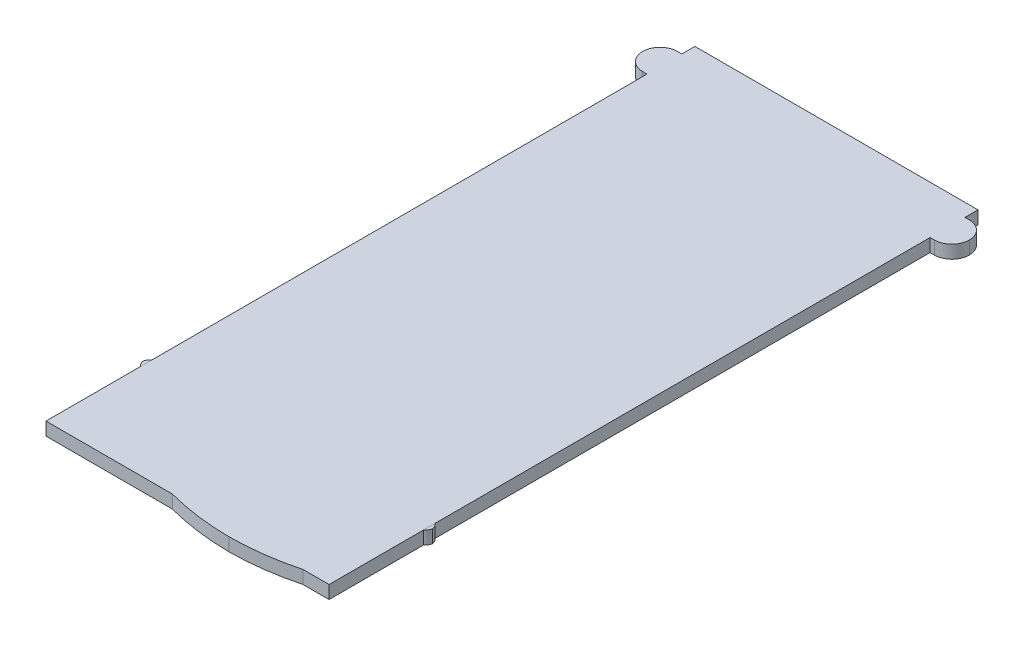
ISO-10303-21;
HEADER;
FILE_DESCRIPTION(('STEP AP214'),'2;1');
FILE_NAME('part.step','',(''),(''),'','','');
FILE_SCHEMA(('AUTOMOTIVE_DESIGN { 1 0 10303 214 1 1 1 1 }'));
ENDSEC;
DATA;
#1=APPLICATION_CONTEXT('core data for automotive mechanical design processes');
#2=APPLICATION_PROTOCOL_DEFINITION('international standard','automotive_design',2000,#1);
#3=PRODUCT_CONTEXT('',#1,'mechanical');
#4=PRODUCT('Part','Part','',(#3));
#5=PRODUCT_RELATED_PRODUCT_CATEGORY('part','',(#4));
#6=PRODUCT_DEFINITION_FORMATION('','',#4);
#7=PRODUCT_DEFINITION_CONTEXT('part definition',#1,'design');
#8=PRODUCT_DEFINITION('design','',#6,#7);
#9=PRODUCT_DEFINITION_SHAPE('','',#8);
#10=(LENGTH_UNIT() NAMED_UNIT(*) SI_UNIT(.MILLI.,.METRE.));
#11=(NAMED_UNIT(*) PLANE_ANGLE_UNIT() SI_UNIT($,.RADIAN.));
#12=(NAMED_UNIT(*) SI_UNIT($,.STERADIAN.) SOLID_ANGLE_UNIT());
#13=UNCERTAINTY_MEASURE_WITH_UNIT(LENGTH_MEASURE(1.E-05),#10,'distance_accuracy_value','');
#14=(GEOMETRIC_REPRESENTATION_CONTEXT(3) GLOBAL_UNCERTAINTY_ASSIGNED_CONTEXT((#13)) GLOBAL_UNIT_ASSIGNED_CONTEXT((#10,
#11,#12)) REPRESENTATION_CONTEXT('',''));
#15=CARTESIAN_POINT('',(0.,0.,0.));
#16=DIRECTION('',(0.,0.,1.));
#17=DIRECTION('',(1.,0.,0.));
#18=AXIS2_PLACEMENT_3D('',#15,#16,#17);
#19=CARTESIAN_POINT('',(-32.5,3.,73.));
#20=DIRECTION('',(1.,0.,0.));
#21=DIRECTION('',(0.,0.,-1.));
#22=AXIS2_PLACEMENT_3D('',#19,#20,#21);
#23=PLANE('',#22);
#24=DIRECTION('',(0.,0.,1.));
#25=VECTOR('',#24,1.);
#26=CARTESIAN_POINT('',(-32.5,0.,73.));
#27=LINE('',#26,#25);
#28=CARTESIAN_POINT('',(-32.5,0.,-62.0000000000006));
#29=VERTEX_POINT('',#28);
#30=CARTESIAN_POINT('',(-32.5,0.,51.7025621529453));
#31=VERTEX_POINT('',#30);
#32=EDGE_CURVE('E218',#29,#31,#27,.T.);
#33=ORIENTED_EDGE('',*,*,#32,.T.);
#34=DIRECTION('',(0.,1.,0.));
#35=VECTOR('',#34,1.);
#36=CARTESIAN_POINT('',(-32.5,0.,51.7025621529453));
#37=LINE('',#36,#35);
#38=CARTESIAN_POINT('',(-32.5,3.,51.7025621529453));
#39=VERTEX_POINT('',#38);
#40=EDGE_CURVE('E246',#31,#39,#37,.T.);
#41=ORIENTED_EDGE('',*,*,#40,.T.);
#42=DIRECTION('',(0.,0.,1.));
#43=VECTOR('',#42,1.);
#44=CARTESIAN_POINT('',(-32.5,3.,73.));
#45=LINE('',#44,#43);
#46=CARTESIAN_POINT('',(-32.5,3.,-62.0000000000006));
#47=VERTEX_POINT('',#46);
#48=EDGE_CURVE('E317',#47,#39,#45,.T.);
#49=ORIENTED_EDGE('',*,*,#48,.F.);
#50=DIRECTION('',(0.,-1.,0.));
#51=VECTOR('',#50,1.);
#52=CARTESIAN_POINT('',(-32.5,0.,-62.0000000000006));
#53=LINE('',#52,#51);
#54=EDGE_CURVE('E276',#47,#29,#53,.T.);
#55=ORIENTED_EDGE('',*,*,#54,.T.);
#56=EDGE_LOOP('',(#33,#41,#49,#55));
#57=FACE_BOUND('',#56,.T.);
#58=ADVANCED_FACE('F42',(#57),#23,.F.);
#59=CARTESIAN_POINT('',(32.5,3.,73.));
#60=DIRECTION('',(-1.,0.,0.));
#61=DIRECTION('',(0.,0.,1.));
#62=AXIS2_PLACEMENT_3D('',#59,#60,#61);
#63=PLANE('',#62);
#64=DIRECTION('',(0.,1.,0.));
#65=VECTOR('',#64,1.);
#66=CARTESIAN_POINT('',(32.5,0.,51.7025621529453));
#67=LINE('',#66,#65);
#68=CARTESIAN_POINT('',(32.5,0.,51.7025621529453));
#69=VERTEX_POINT('',#68);
#70=CARTESIAN_POINT('',(32.5,3.,51.7025621529453));
#71=VERTEX_POINT('',#70);
#72=EDGE_CURVE('E260',#69,#71,#67,.T.);
#73=ORIENTED_EDGE('',*,*,#72,.F.);
#74=DIRECTION('',(0.,0.,-1.));
#75=VECTOR('',#74,1.);
#76=CARTESIAN_POINT('',(32.5,0.,73.));
#77=LINE('',#76,#75);
#78=CARTESIAN_POINT('',(32.5,0.,-62.0000000000006));
#79=VERTEX_POINT('',#78);
#80=EDGE_CURVE('E321',#69,#79,#77,.T.);
#81=ORIENTED_EDGE('',*,*,#80,.T.);
#82=DIRECTION('',(0.,-1.,0.));
#83=VECTOR('',#82,1.);
#84=CARTESIAN_POINT('',(32.5,0.,-62.0000000000006));
#85=LINE('',#84,#83);
#86=CARTESIAN_POINT('',(32.5,3.,-62.0000000000006));
#87=VERTEX_POINT('',#86);
#88=EDGE_CURVE('E291',#87,#79,#85,.T.);
#89=ORIENTED_EDGE('',*,*,#88,.F.);
#90=DIRECTION('',(0.,0.,-1.));
#91=VECTOR('',#90,1.);
#92=CARTESIAN_POINT('',(32.5,3.,73.));
#93=LINE('',#92,#91);
#94=EDGE_CURVE('E309',#71,#87,#93,.T.);
#95=ORIENTED_EDGE('',*,*,#94,.F.);
#96=EDGE_LOOP('',(#73,#81,#89,#95));
#97=FACE_BOUND('',#96,.T.);
#98=ADVANCED_FACE('F428',(#97),#63,.F.);
#99=DIRECTION('',(0.,-1.,0.));
#100=VECTOR('',#99,1.);
#101=CARTESIAN_POINT('',(32.5,0.,54.3035167130892));
#102=LINE('',#101,#100);
#103=CARTESIAN_POINT('',(32.5,3.,54.3035167130892));
#104=VERTEX_POINT('',#103);
#105=CARTESIAN_POINT('',(32.5,0.,54.3035167130892));
#106=VERTEX_POINT('',#105);
#107=EDGE_CURVE('E265',#104,#106,#102,.T.);
#108=ORIENTED_EDGE('',*,*,#107,.F.);
#109=CARTESIAN_POINT('',(32.5,3.,76.));
#110=VERTEX_POINT('',#109);
#111=EDGE_CURVE('E305',#110,#104,#93,.T.);
#112=ORIENTED_EDGE('',*,*,#111,.F.);
#113=DIRECTION('',(0.,1.,0.));
#114=VECTOR('',#113,1.);
#115=CARTESIAN_POINT('',(32.5,0.,76.));
#116=LINE('',#115,#114);
#117=CARTESIAN_POINT('',(32.5,0.,76.));
#118=VERTEX_POINT('',#117);
#119=EDGE_CURVE('E238',#118,#110,#116,.T.);
#120=ORIENTED_EDGE('',*,*,#119,.F.);
#121=EDGE_CURVE('E318',#118,#106,#77,.T.);
#122=ORIENTED_EDGE('',*,*,#121,.T.);
#123=EDGE_LOOP('',(#108,#112,#120,#122));
#124=FACE_BOUND('',#123,.T.);
#125=ADVANCED_FACE('F434',(#124),#63,.F.);
#126=CARTESIAN_POINT('',(-32.5,0.,-73.));
#127=VERTEX_POINT('',#126);
#128=CARTESIAN_POINT('',(-32.5,0.,-70.0000000000006));
#129=VERTEX_POINT('',#128);
#130=EDGE_CURVE('E221',#127,#129,#27,.T.);
#131=ORIENTED_EDGE('',*,*,#130,.T.);
#132=DIRECTION('',(0.,1.,0.));
#133=VECTOR('',#132,1.);
#134=CARTESIAN_POINT('',(-32.5,0.,-70.0000000000006));
#135=LINE('',#134,#133);
#136=CARTESIAN_POINT('',(-32.5,3.,-70.0000000000006));
#137=VERTEX_POINT('',#136);
#138=EDGE_CURVE('E273',#129,#137,#135,.T.);
#139=ORIENTED_EDGE('',*,*,#138,.T.);
#140=CARTESIAN_POINT('',(-32.5,3.,-73.));
#141=VERTEX_POINT('',#140);
#142=EDGE_CURVE('E313',#141,#137,#45,.T.);
#143=ORIENTED_EDGE('',*,*,#142,.F.);
#144=DIRECTION('',(0.,-1.,0.));
#145=VECTOR('',#144,1.);
#146=CARTESIAN_POINT('',(-32.5,3.,-73.));
#147=LINE('',#146,#145);
#148=EDGE_CURVE('E316',#141,#127,#147,.T.);
#149=ORIENTED_EDGE('',*,*,#148,.T.);
#150=EDGE_LOOP('',(#131,#139,#143,#149));
#151=FACE_BOUND('',#150,.T.);
#152=ADVANCED_FACE('F430',(#151),#23,.F.);
#153=DIRECTION('',(0.,1.,0.));
#154=VECTOR('',#153,1.);
#155=CARTESIAN_POINT('',(32.5,0.,-70.0000000000006));
#156=LINE('',#155,#154);
#157=CARTESIAN_POINT('',(32.5,0.,-70.0000000000006));
#158=VERTEX_POINT('',#157);
#159=CARTESIAN_POINT('',(32.5,3.,-70.0000000000006));
#160=VERTEX_POINT('',#159);
#161=EDGE_CURVE('E288',#158,#160,#156,.T.);
#162=ORIENTED_EDGE('',*,*,#161,.F.);
#163=CARTESIAN_POINT('',(32.5,0.,-73.));
#164=VERTEX_POINT('',#163);
#165=EDGE_CURVE('E304',#158,#164,#77,.T.);
#166=ORIENTED_EDGE('',*,*,#165,.T.);
#167=DIRECTION('',(0.,-1.,0.));
#168=VECTOR('',#167,1.);
#169=CARTESIAN_POINT('',(32.5,3.,-73.));
#170=LINE('',#169,#168);
#171=CARTESIAN_POINT('',(32.5,3.,-73.));
#172=VERTEX_POINT('',#171);
#173=EDGE_CURVE('E326',#172,#164,#170,.T.);
#174=ORIENTED_EDGE('',*,*,#173,.F.);
#175=EDGE_CURVE('E310',#160,#172,#93,.T.);
#176=ORIENTED_EDGE('',*,*,#175,.F.);
#177=EDGE_LOOP('',(#162,#166,#174,#176));
#178=FACE_BOUND('',#177,.T.);
#179=ADVANCED_FACE('F437',(#178),#63,.F.);
#180=CARTESIAN_POINT('',(-32.5,3.,-73.));
#181=DIRECTION('',(0.,0.,1.));
#182=DIRECTION('',(1.,0.,0.));
#183=AXIS2_PLACEMENT_3D('',#180,#181,#182);
#184=PLANE('',#183);
#185=DIRECTION('',(-1.,0.,0.));
#186=VECTOR('',#185,1.);
#187=CARTESIAN_POINT('',(-32.5,0.,-73.));
#188=LINE('',#187,#186);
#189=EDGE_CURVE('E219',#164,#127,#188,.T.);
#190=ORIENTED_EDGE('',*,*,#189,.T.);
#191=ORIENTED_EDGE('',*,*,#148,.F.);
#192=DIRECTION('',(-1.,0.,0.));
#193=VECTOR('',#192,1.);
#194=CARTESIAN_POINT('',(-32.5,3.,-73.));
#195=LINE('',#194,#193);
#196=EDGE_CURVE('E308',#172,#141,#195,.T.);
#197=ORIENTED_EDGE('',*,*,#196,.F.);
#198=ORIENTED_EDGE('',*,*,#173,.T.);
#199=EDGE_LOOP('',(#190,#191,#197,#198));
#200=FACE_BOUND('',#199,.T.);
#201=ADVANCED_FACE('F443',(#200),#184,.F.);
#202=CARTESIAN_POINT('',(-32.5,3.,54.3035167130892));
#203=VERTEX_POINT('',#202);
#204=CARTESIAN_POINT('',(-32.5,3.,76.));
#205=VERTEX_POINT('',#204);
#206=EDGE_CURVE('E312',#203,#205,#45,.T.);
#207=ORIENTED_EDGE('',*,*,#206,.F.);
#208=DIRECTION('',(0.,-1.,0.));
#209=VECTOR('',#208,1.);
#210=CARTESIAN_POINT('',(-32.5,0.,54.3035167130892));
#211=LINE('',#210,#209);
#212=CARTESIAN_POINT('',(-32.5,0.,54.3035167130892));
#213=VERTEX_POINT('',#212);
#214=EDGE_CURVE('E215',#203,#213,#211,.T.);
#215=ORIENTED_EDGE('',*,*,#214,.T.);
#216=CARTESIAN_POINT('',(-32.5,0.,76.));
#217=VERTEX_POINT('',#216);
#218=EDGE_CURVE('E209',#213,#217,#27,.T.);
#219=ORIENTED_EDGE('',*,*,#218,.T.);
#220=DIRECTION('',(0.,1.,0.));
#221=VECTOR('',#220,1.);
#222=CARTESIAN_POINT('',(-32.5,0.,76.));
#223=LINE('',#222,#221);
#224=EDGE_CURVE('E212',#217,#205,#223,.T.);
#225=ORIENTED_EDGE('',*,*,#224,.T.);
#226=EDGE_LOOP('',(#207,#215,#219,#225));
#227=FACE_BOUND('',#226,.T.);
#228=ADVANCED_FACE('F211',(#227),#23,.F.);
#229=CARTESIAN_POINT('',(0.,3.,0.));
#230=DIRECTION('',(0.,-1.,0.));
#231=DIRECTION('',(0.,0.,-1.));
#232=AXIS2_PLACEMENT_3D('',#229,#230,#231);
#233=PLANE('',#232);
#234=CARTESIAN_POINT('',(11.8622914957372,3.,18.));
#235=DIRECTION('',(0.,-1.,0.));
#236=DIRECTION('',(0.,0.,-1.));
#237=AXIS2_PLACEMENT_3D('',#234,#235,#236);
#238=CIRCLE('',#237,60.);
#239=CARTESIAN_POINT('',(-3.5,3.,76.));
#240=VERTEX_POINT('',#239);
#241=CARTESIAN_POINT('',(11.5,3.,77.9989061972976));
#242=VERTEX_POINT('',#241);
#243=EDGE_CURVE('E64',#240,#242,#238,.F.);
#244=ORIENTED_EDGE('',*,*,#243,.T.);
#245=CARTESIAN_POINT('',(11.1377085042628,3.,18.));
#246=DIRECTION('',(0.,-1.,0.));
#247=DIRECTION('',(0.,0.,-1.));
#248=AXIS2_PLACEMENT_3D('',#245,#246,#247);
#249=CIRCLE('',#248,60.);
#250=CARTESIAN_POINT('',(26.5,3.,76.));
#251=VERTEX_POINT('',#250);
#252=EDGE_CURVE('E380',#242,#251,#249,.F.);
#253=ORIENTED_EDGE('',*,*,#252,.T.);
#254=DIRECTION('',(1.,0.,0.));
#255=VECTOR('',#254,1.);
#256=CARTESIAN_POINT('',(0.,3.,76.));
#257=LINE('',#256,#255);
#258=EDGE_CURVE('E232',#251,#110,#257,.T.);
#259=ORIENTED_EDGE('',*,*,#258,.T.);
#260=ORIENTED_EDGE('',*,*,#111,.T.);
#261=DIRECTION('',(0.,0.,1.));
#262=VECTOR('',#261,1.);
#263=CARTESIAN_POINT('',(32.5,3.,0.));
#264=LINE('',#263,#262);
#265=EDGE_CURVE('E269',#71,#104,#264,.T.);
#266=ORIENTED_EDGE('',*,*,#265,.F.);
#267=ORIENTED_EDGE('',*,*,#94,.T.);
#268=DIRECTION('',(-1.,0.,0.));
#269=VECTOR('',#268,1.);
#270=CARTESIAN_POINT('',(37.5,3.,-62.0000000000006));
#271=LINE('',#270,#269);
#272=CARTESIAN_POINT('',(33.5,3.,-62.0000000000006));
#273=VERTEX_POINT('',#272);
#274=EDGE_CURVE('E299',#273,#87,#271,.T.);
#275=ORIENTED_EDGE('',*,*,#274,.F.);
#276=CARTESIAN_POINT('',(33.5,3.,-66.0000000000006));
#277=DIRECTION('',(0.,-1.,0.));
#278=DIRECTION('',(0.,0.,-1.));
#279=AXIS2_PLACEMENT_3D('',#276,#277,#278);
#280=CIRCLE('',#279,4.);
#281=CARTESIAN_POINT('',(37.5,3.,-66.0000000000006));
#282=VERTEX_POINT('',#281);
#283=EDGE_CURVE('E338',#273,#282,#280,.F.);
#284=ORIENTED_EDGE('',*,*,#283,.T.);
#285=CARTESIAN_POINT('',(33.5,3.,-66.0000000000006));
#286=DIRECTION('',(0.,-1.,0.));
#287=DIRECTION('',(0.,0.,-1.));
#288=AXIS2_PLACEMENT_3D('',#285,#286,#287);
#289=CIRCLE('',#288,4.);
#290=CARTESIAN_POINT('',(33.5,3.,-70.0000000000006));
#291=VERTEX_POINT('',#290);
#292=EDGE_CURVE('E336',#282,#291,#289,.F.);
#293=ORIENTED_EDGE('',*,*,#292,.T.);
#294=DIRECTION('',(-1.,0.,0.));
#295=VECTOR('',#294,1.);
#296=CARTESIAN_POINT('',(37.5,3.,-70.0000000000006));
#297=LINE('',#296,#295);
#298=EDGE_CURVE('E302',#291,#160,#297,.T.);
#299=ORIENTED_EDGE('',*,*,#298,.T.);
#300=ORIENTED_EDGE('',*,*,#175,.T.);
#301=ORIENTED_EDGE('',*,*,#196,.T.);
#302=ORIENTED_EDGE('',*,*,#142,.T.);
#303=DIRECTION('',(1.,0.,0.));
#304=VECTOR('',#303,1.);
#305=CARTESIAN_POINT('',(-37.5,3.,-70.0000000000006));
#306=LINE('',#305,#304);
#307=CARTESIAN_POINT('',(-33.5,3.,-70.0000000000006));
#308=VERTEX_POINT('',#307);
#309=EDGE_CURVE('E279',#308,#137,#306,.T.);
#310=ORIENTED_EDGE('',*,*,#309,.F.);
#311=CARTESIAN_POINT('',(-33.5,3.,-66.0000000000006));
#312=DIRECTION('',(0.,-1.,0.));
#313=DIRECTION('',(0.,0.,-1.));
#314=AXIS2_PLACEMENT_3D('',#311,#312,#313);
#315=CIRCLE('',#314,4.);
#316=CARTESIAN_POINT('',(-37.5,3.,-66.0000000000006));
#317=VERTEX_POINT('',#316);
#318=EDGE_CURVE('E351',#308,#317,#315,.F.);
#319=ORIENTED_EDGE('',*,*,#318,.T.);
#320=CARTESIAN_POINT('',(-33.5,3.,-66.0000000000006));
#321=DIRECTION('',(0.,-1.,0.));
#322=DIRECTION('',(0.,0.,-1.));
#323=AXIS2_PLACEMENT_3D('',#320,#321,#322);
#324=CIRCLE('',#323,4.);
#325=CARTESIAN_POINT('',(-33.5,3.,-62.0000000000006));
#326=VERTEX_POINT('',#325);
#327=EDGE_CURVE('E353',#317,#326,#324,.F.);
#328=ORIENTED_EDGE('',*,*,#327,.T.);
#329=DIRECTION('',(1.,0.,0.));
#330=VECTOR('',#329,1.);
#331=CARTESIAN_POINT('',(-37.5,3.,-62.0000000000006));
#332=LINE('',#331,#330);
#333=EDGE_CURVE('E281',#326,#47,#332,.T.);
#334=ORIENTED_EDGE('',*,*,#333,.T.);
#335=ORIENTED_EDGE('',*,*,#48,.T.);
#336=DIRECTION('',(0.,0.,-1.));
#337=VECTOR('',#336,1.);
#338=CARTESIAN_POINT('',(-32.5,3.,0.));
#339=LINE('',#338,#337);
#340=EDGE_CURVE('E256',#203,#39,#339,.T.);
#341=ORIENTED_EDGE('',*,*,#340,.F.);
#342=ORIENTED_EDGE('',*,*,#206,.T.);
#343=EDGE_CURVE('E227',#205,#240,#257,.T.);
#344=ORIENTED_EDGE('',*,*,#343,.T.);
#345=EDGE_LOOP('',(#244,#253,#259,#260,#266,#267,#275,#284,#293,#299,#300,#301,#302,#310,#319,
#328,#334,#335,#341,#342,#344));
#346=FACE_BOUND('',#345,.T.);
#347=ADVANCED_FACE('F384',(#346),#233,.F.);
#348=CARTESIAN_POINT('',(0.,0.,0.));
#349=DIRECTION('',(0.,-1.,0.));
#350=DIRECTION('',(0.,0.,-1.));
#351=AXIS2_PLACEMENT_3D('',#348,#349,#350);
#352=PLANE('',#351);
#353=DIRECTION('',(1.,0.,0.));
#354=VECTOR('',#353,1.);
#355=CARTESIAN_POINT('',(0.,0.,76.));
#356=LINE('',#355,#354);
#357=CARTESIAN_POINT('',(26.5,0.,76.));
#358=VERTEX_POINT('',#357);
#359=EDGE_CURVE('E229',#358,#118,#356,.T.);
#360=ORIENTED_EDGE('',*,*,#359,.F.);
#361=CARTESIAN_POINT('',(11.1377085042628,0.,18.));
#362=DIRECTION('',(0.,-1.,0.));
#363=DIRECTION('',(0.,0.,-1.));
#364=AXIS2_PLACEMENT_3D('',#361,#362,#363);
#365=CIRCLE('',#364,60.);
#366=CARTESIAN_POINT('',(11.5,0.,77.9989061972976));
#367=VERTEX_POINT('',#366);
#368=EDGE_CURVE('E11',#358,#367,#365,.T.);
#369=ORIENTED_EDGE('',*,*,#368,.T.);
#370=CARTESIAN_POINT('',(11.8622914957372,0.,18.));
#371=DIRECTION('',(0.,-1.,0.));
#372=DIRECTION('',(0.,0.,-1.));
#373=AXIS2_PLACEMENT_3D('',#370,#371,#372);
#374=CIRCLE('',#373,60.);
#375=CARTESIAN_POINT('',(-3.5,0.,76.));
#376=VERTEX_POINT('',#375);
#377=EDGE_CURVE('E51',#367,#376,#374,.T.);
#378=ORIENTED_EDGE('',*,*,#377,.T.);
#379=EDGE_CURVE('E225',#217,#376,#356,.T.);
#380=ORIENTED_EDGE('',*,*,#379,.F.);
#381=ORIENTED_EDGE('',*,*,#218,.F.);
#382=CARTESIAN_POINT('',(-31.3,0.,52.7035167130892));
#383=DIRECTION('',(0.,-1.,0.));
#384=DIRECTION('',(0.,0.,-1.));
#385=AXIS2_PLACEMENT_3D('',#382,#383,#384);
#386=CIRCLE('',#385,2.);
#387=CARTESIAN_POINT('',(-33.2774443456762,0.,53.0030394330172));
#388=VERTEX_POINT('',#387);
#389=EDGE_CURVE('E373',#213,#388,#386,.T.);
#390=ORIENTED_EDGE('',*,*,#389,.T.);
#391=CARTESIAN_POINT('',(-31.3,0.,53.3025621529453));
#392=DIRECTION('',(0.,-1.,0.));
#393=DIRECTION('',(0.,0.,-1.));
#394=AXIS2_PLACEMENT_3D('',#391,#392,#393);
#395=CIRCLE('',#394,2.);
#396=EDGE_CURVE('E375',#388,#31,#395,.T.);
#397=ORIENTED_EDGE('',*,*,#396,.T.);
#398=ORIENTED_EDGE('',*,*,#32,.F.);
#399=DIRECTION('',(1.,0.,0.));
#400=VECTOR('',#399,1.);
#401=CARTESIAN_POINT('',(-37.5,0.,-62.0000000000006));
#402=LINE('',#401,#400);
#403=CARTESIAN_POINT('',(-33.5,0.,-62.0000000000006));
#404=VERTEX_POINT('',#403);
#405=EDGE_CURVE('E283',#404,#29,#402,.T.);
#406=ORIENTED_EDGE('',*,*,#405,.F.);
#407=CARTESIAN_POINT('',(-33.5,0.,-66.0000000000006));
#408=DIRECTION('',(0.,-1.,0.));
#409=DIRECTION('',(0.,0.,-1.));
#410=AXIS2_PLACEMENT_3D('',#407,#408,#409);
#411=CIRCLE('',#410,4.);
#412=CARTESIAN_POINT('',(-37.5,0.,-66.0000000000006));
#413=VERTEX_POINT('',#412);
#414=EDGE_CURVE('E349',#404,#413,#411,.T.);
#415=ORIENTED_EDGE('',*,*,#414,.T.);
#416=CARTESIAN_POINT('',(-33.5,0.,-66.0000000000006));
#417=DIRECTION('',(0.,-1.,0.));
#418=DIRECTION('',(0.,0.,-1.));
#419=AXIS2_PLACEMENT_3D('',#416,#417,#418);
#420=CIRCLE('',#419,4.);
#421=CARTESIAN_POINT('',(-33.5,0.,-70.0000000000006));
#422=VERTEX_POINT('',#421);
#423=EDGE_CURVE('E347',#413,#422,#420,.T.);
#424=ORIENTED_EDGE('',*,*,#423,.T.);
#425=DIRECTION('',(1.,0.,0.));
#426=VECTOR('',#425,1.);
#427=CARTESIAN_POINT('',(-37.5,0.,-70.0000000000006));
#428=LINE('',#427,#426);
#429=EDGE_CURVE('E285',#422,#129,#428,.T.);
#430=ORIENTED_EDGE('',*,*,#429,.T.);
#431=ORIENTED_EDGE('',*,*,#130,.F.);
#432=ORIENTED_EDGE('',*,*,#189,.F.);
#433=ORIENTED_EDGE('',*,*,#165,.F.);
#434=DIRECTION('',(-1.,0.,0.));
#435=VECTOR('',#434,1.);
#436=CARTESIAN_POINT('',(37.5,0.,-70.0000000000006));
#437=LINE('',#436,#435);
#438=CARTESIAN_POINT('',(33.5,0.,-70.0000000000006));
#439=VERTEX_POINT('',#438);
#440=EDGE_CURVE('E294',#439,#158,#437,.T.);
#441=ORIENTED_EDGE('',*,*,#440,.F.);
#442=CARTESIAN_POINT('',(33.5,0.,-66.0000000000006));
#443=DIRECTION('',(0.,-1.,0.));
#444=DIRECTION('',(0.,0.,-1.));
#445=AXIS2_PLACEMENT_3D('',#442,#443,#444);
#446=CIRCLE('',#445,4.);
#447=CARTESIAN_POINT('',(37.5,0.,-66.0000000000006));
#448=VERTEX_POINT('',#447);
#449=EDGE_CURVE('E329',#439,#448,#446,.T.);
#450=ORIENTED_EDGE('',*,*,#449,.T.);
#451=CARTESIAN_POINT('',(33.5,0.,-66.0000000000006));
#452=DIRECTION('',(0.,-1.,0.));
#453=DIRECTION('',(0.,0.,-1.));
#454=AXIS2_PLACEMENT_3D('',#451,#452,#453);
#455=CIRCLE('',#454,4.);
#456=CARTESIAN_POINT('',(33.5,0.,-62.0000000000006));
#457=VERTEX_POINT('',#456);
#458=EDGE_CURVE('E331',#448,#457,#455,.T.);
#459=ORIENTED_EDGE('',*,*,#458,.T.);
#460=DIRECTION('',(-1.,0.,0.));
#461=VECTOR('',#460,1.);
#462=CARTESIAN_POINT('',(37.5,0.,-62.0000000000006));
#463=LINE('',#462,#461);
#464=EDGE_CURVE('E296',#457,#79,#463,.T.);
#465=ORIENTED_EDGE('',*,*,#464,.T.);
#466=ORIENTED_EDGE('',*,*,#80,.F.);
#467=CARTESIAN_POINT('',(31.3,0.,53.3025621529453));
#468=DIRECTION('',(0.,-1.,0.));
#469=DIRECTION('',(0.,0.,-1.));
#470=AXIS2_PLACEMENT_3D('',#467,#468,#469);
#471=CIRCLE('',#470,2.);
#472=CARTESIAN_POINT('',(33.2774443456762,0.,53.0030394330172));
#473=VERTEX_POINT('',#472);
#474=EDGE_CURVE('E365',#69,#473,#471,.T.);
#475=ORIENTED_EDGE('',*,*,#474,.T.);
#476=CARTESIAN_POINT('',(31.3,0.,52.7035167130892));
#477=DIRECTION('',(0.,-1.,0.));
#478=DIRECTION('',(0.,0.,-1.));
#479=AXIS2_PLACEMENT_3D('',#476,#477,#478);
#480=CIRCLE('',#479,2.);
#481=EDGE_CURVE('E363',#473,#106,#480,.T.);
#482=ORIENTED_EDGE('',*,*,#481,.T.);
#483=ORIENTED_EDGE('',*,*,#121,.F.);
#484=EDGE_LOOP('',(#360,#369,#378,#380,#381,#390,#397,#398,#406,#415,#424,#430,#431,#432,#433,
#441,#450,#459,#465,#466,#475,#482,#483));
#485=FACE_BOUND('',#484,.T.);
#486=ADVANCED_FACE('F231',(#485),#352,.T.);
#487=CARTESIAN_POINT('',(37.5,0.,-70.0000000000006));
#488=DIRECTION('',(0.,0.,1.));
#489=DIRECTION('',(1.,0.,0.));
#490=AXIS2_PLACEMENT_3D('',#487,#488,#489);
#491=PLANE('',#490);
#492=ORIENTED_EDGE('',*,*,#298,.F.);
#493=DIRECTION('',(0.,1.,0.));
#494=VECTOR('',#493,1.);
#495=CARTESIAN_POINT('',(33.5,0.,-70.0000000000006));
#496=LINE('',#495,#494);
#497=EDGE_CURVE('E340',#291,#439,#496,.F.);
#498=ORIENTED_EDGE('',*,*,#497,.T.);
#499=ORIENTED_EDGE('',*,*,#440,.T.);
#500=ORIENTED_EDGE('',*,*,#161,.T.);
#501=EDGE_LOOP('',(#492,#498,#499,#500));
#502=FACE_BOUND('',#501,.T.);
#503=ADVANCED_FACE('F582',(#502),#491,.F.);
#504=CARTESIAN_POINT('',(37.5,0.,-62.0000000000006));
#505=DIRECTION('',(0.,0.,-1.));
#506=DIRECTION('',(-1.,0.,0.));
#507=AXIS2_PLACEMENT_3D('',#504,#505,#506);
#508=PLANE('',#507);
#509=ORIENTED_EDGE('',*,*,#464,.F.);
#510=DIRECTION('',(0.,-1.,0.));
#511=VECTOR('',#510,1.);
#512=CARTESIAN_POINT('',(33.5,3.,-62.0000000000006));
#513=LINE('',#512,#511);
#514=EDGE_CURVE('E333',#457,#273,#513,.F.);
#515=ORIENTED_EDGE('',*,*,#514,.T.);
#516=ORIENTED_EDGE('',*,*,#274,.T.);
#517=ORIENTED_EDGE('',*,*,#88,.T.);
#518=EDGE_LOOP('',(#509,#515,#516,#517));
#519=FACE_BOUND('',#518,.T.);
#520=ADVANCED_FACE('F463',(#519),#508,.F.);
#521=CARTESIAN_POINT('',(33.5,0.,-66.0000000000006));
#522=DIRECTION('',(0.,-1.,0.));
#523=DIRECTION('',(0.,0.,-1.));
#524=AXIS2_PLACEMENT_3D('',#521,#522,#523);
#525=CYLINDRICAL_SURFACE('',#524,4.);
#526=ORIENTED_EDGE('',*,*,#497,.F.);
#527=ORIENTED_EDGE('',*,*,#292,.F.);
#528=DIRECTION('',(0.,1.,0.));
#529=VECTOR('',#528,1.);
#530=CARTESIAN_POINT('',(37.5,3.,-66.0000000000006));
#531=LINE('',#530,#529);
#532=EDGE_CURVE('E287',#448,#282,#531,.T.);
#533=ORIENTED_EDGE('',*,*,#532,.F.);
#534=ORIENTED_EDGE('',*,*,#449,.F.);
#535=EDGE_LOOP('',(#526,#527,#533,#534));
#536=FACE_BOUND('',#535,.T.);
#537=ADVANCED_FACE('F459',(#536),#525,.T.);
#538=CARTESIAN_POINT('',(33.5,0.,-66.0000000000006));
#539=DIRECTION('',(0.,1.,0.));
#540=DIRECTION('',(0.,0.,1.));
#541=AXIS2_PLACEMENT_3D('',#538,#539,#540);
#542=CYLINDRICAL_SURFACE('',#541,4.);
#543=ORIENTED_EDGE('',*,*,#283,.F.);
#544=ORIENTED_EDGE('',*,*,#514,.F.);
#545=ORIENTED_EDGE('',*,*,#458,.F.);
#546=ORIENTED_EDGE('',*,*,#532,.T.);
#547=EDGE_LOOP('',(#543,#544,#545,#546));
#548=FACE_BOUND('',#547,.T.);
#549=ADVANCED_FACE('F455',(#548),#542,.T.);
#550=CARTESIAN_POINT('',(-37.5,0.,-70.0000000000006));
#551=DIRECTION('',(0.,0.,-1.));
#552=DIRECTION('',(-1.,0.,0.));
#553=AXIS2_PLACEMENT_3D('',#550,#551,#552);
#554=PLANE('',#553);
#555=ORIENTED_EDGE('',*,*,#429,.F.);
#556=DIRECTION('',(0.,1.,0.));
#557=VECTOR('',#556,1.);
#558=CARTESIAN_POINT('',(-33.5,0.,-70.0000000000006));
#559=LINE('',#558,#557);
#560=EDGE_CURVE('E355',#422,#308,#559,.T.);
#561=ORIENTED_EDGE('',*,*,#560,.T.);
#562=ORIENTED_EDGE('',*,*,#309,.T.);
#563=ORIENTED_EDGE('',*,*,#138,.F.);
#564=EDGE_LOOP('',(#555,#561,#562,#563));
#565=FACE_BOUND('',#564,.T.);
#566=ADVANCED_FACE('F458',(#565),#554,.T.);
#567=CARTESIAN_POINT('',(-37.5,0.,-62.0000000000006));
#568=DIRECTION('',(0.,0.,1.));
#569=DIRECTION('',(1.,0.,0.));
#570=AXIS2_PLACEMENT_3D('',#567,#568,#569);
#571=PLANE('',#570);
#572=ORIENTED_EDGE('',*,*,#333,.F.);
#573=DIRECTION('',(0.,-1.,0.));
#574=VECTOR('',#573,1.);
#575=CARTESIAN_POINT('',(-33.5,0.,-62.0000000000006));
#576=LINE('',#575,#574);
#577=EDGE_CURVE('E342',#326,#404,#576,.T.);
#578=ORIENTED_EDGE('',*,*,#577,.T.);
#579=ORIENTED_EDGE('',*,*,#405,.T.);
#580=ORIENTED_EDGE('',*,*,#54,.F.);
#581=EDGE_LOOP('',(#572,#578,#579,#580));
#582=FACE_BOUND('',#581,.T.);
#583=ADVANCED_FACE('F473',(#582),#571,.T.);
#584=CARTESIAN_POINT('',(-33.5,0.,-66.0000000000006));
#585=DIRECTION('',(0.,1.,0.));
#586=DIRECTION('',(0.,0.,1.));
#587=AXIS2_PLACEMENT_3D('',#584,#585,#586);
#588=CYLINDRICAL_SURFACE('',#587,4.);
#589=DIRECTION('',(0.,1.,0.));
#590=VECTOR('',#589,1.);
#591=CARTESIAN_POINT('',(-37.5,0.,-66.0000000000006));
#592=LINE('',#591,#590);
#593=EDGE_CURVE('E272',#317,#413,#592,.F.);
#594=ORIENTED_EDGE('',*,*,#593,.F.);
#595=ORIENTED_EDGE('',*,*,#318,.F.);
#596=ORIENTED_EDGE('',*,*,#560,.F.);
#597=ORIENTED_EDGE('',*,*,#423,.F.);
#598=EDGE_LOOP('',(#594,#595,#596,#597));
#599=FACE_BOUND('',#598,.T.);
#600=ADVANCED_FACE('F469',(#599),#588,.T.);
#601=CARTESIAN_POINT('',(-33.5,0.,-66.0000000000006));
#602=DIRECTION('',(0.,-1.,0.));
#603=DIRECTION('',(0.,0.,-1.));
#604=AXIS2_PLACEMENT_3D('',#601,#602,#603);
#605=CYLINDRICAL_SURFACE('',#604,4.);
#606=ORIENTED_EDGE('',*,*,#327,.F.);
#607=ORIENTED_EDGE('',*,*,#593,.T.);
#608=ORIENTED_EDGE('',*,*,#414,.F.);
#609=ORIENTED_EDGE('',*,*,#577,.F.);
#610=EDGE_LOOP('',(#606,#607,#608,#609));
#611=FACE_BOUND('',#610,.T.);
#612=ADVANCED_FACE('F465',(#611),#605,.T.);
#613=CARTESIAN_POINT('',(32.5,0.,0.));
#614=DIRECTION('',(1.,0.,0.));
#615=DIRECTION('',(0.,0.,-1.));
#616=AXIS2_PLACEMENT_3D('',#613,#614,#615);
#617=PLANE('',#616);
#618=CARTESIAN_POINT('',(32.5,3.0011014155507,51.7025621529453));
#619=VERTEX_POINT('',#618);
#620=EDGE_CURVE('E263',#71,#619,#67,.T.);
#621=ORIENTED_EDGE('',*,*,#620,.F.);
#622=ORIENTED_EDGE('',*,*,#265,.T.);
#623=CARTESIAN_POINT('',(32.5,3.0011014155507,54.3035167130892));
#624=VERTEX_POINT('',#623);
#625=EDGE_CURVE('E266',#624,#104,#102,.T.);
#626=ORIENTED_EDGE('',*,*,#625,.F.);
#627=DIRECTION('',(0.,0.,1.));
#628=VECTOR('',#627,1.);
#629=CARTESIAN_POINT('',(32.5,3.0011014155507,51.7025621529453));
#630=LINE('',#629,#628);
#631=EDGE_CURVE('E262',#619,#624,#630,.T.);
#632=ORIENTED_EDGE('',*,*,#631,.F.);
#633=EDGE_LOOP('',(#621,#622,#626,#632));
#634=FACE_BOUND('',#633,.T.);
#635=ADVANCED_FACE('F468',(#634),#617,.F.);
#636=CARTESIAN_POINT('',(33.3,3.0011014155507,51.7025621529453));
#637=DIRECTION('',(0.,-1.,0.));
#638=DIRECTION('',(0.,0.,-1.));
#639=AXIS2_PLACEMENT_3D('',#636,#637,#638);
#640=PLANE('',#639);
#641=CARTESIAN_POINT('',(31.3,3.0011014155507,52.7035167130892));
#642=DIRECTION('',(0.,-1.,0.));
#643=DIRECTION('',(0.,0.,-1.));
#644=AXIS2_PLACEMENT_3D('',#641,#642,#643);
#645=CIRCLE('',#644,2.);
#646=CARTESIAN_POINT('',(33.2774443456762,3.0011014155507,53.0030394330172));
#647=VERTEX_POINT('',#646);
#648=EDGE_CURVE('E357',#624,#647,#645,.F.);
#649=ORIENTED_EDGE('',*,*,#648,.T.);
#650=CARTESIAN_POINT('',(31.3,3.0011014155507,53.3025621529453));
#651=DIRECTION('',(0.,-1.,0.));
#652=DIRECTION('',(0.,0.,-1.));
#653=AXIS2_PLACEMENT_3D('',#650,#651,#652);
#654=CIRCLE('',#653,2.);
#655=EDGE_CURVE('E361',#647,#619,#654,.F.);
#656=ORIENTED_EDGE('',*,*,#655,.T.);
#657=ORIENTED_EDGE('',*,*,#631,.T.);
#658=EDGE_LOOP('',(#649,#656,#657));
#659=FACE_BOUND('',#658,.T.);
#660=ADVANCED_FACE('F481',(#659),#640,.F.);
#661=CARTESIAN_POINT('',(31.3,0.,52.7035167130892));
#662=DIRECTION('',(0.,1.,0.));
#663=DIRECTION('',(0.,0.,1.));
#664=AXIS2_PLACEMENT_3D('',#661,#662,#663);
#665=CYLINDRICAL_SURFACE('',#664,2.);
#666=ORIENTED_EDGE('',*,*,#107,.T.);
#667=ORIENTED_EDGE('',*,*,#481,.F.);
#668=DIRECTION('',(0.,1.,0.));
#669=VECTOR('',#668,1.);
#670=CARTESIAN_POINT('',(33.2774443456762,1.50055070777535,53.0030394330172));
#671=LINE('',#670,#669);
#672=EDGE_CURVE('E259',#647,#473,#671,.F.);
#673=ORIENTED_EDGE('',*,*,#672,.F.);
#674=ORIENTED_EDGE('',*,*,#648,.F.);
#675=ORIENTED_EDGE('',*,*,#625,.T.);
#676=EDGE_LOOP('',(#666,#667,#673,#674,#675));
#677=FACE_BOUND('',#676,.T.);
#678=ADVANCED_FACE('F477',(#677),#665,.T.);
#679=CARTESIAN_POINT('',(31.3,0.,53.3025621529453));
#680=DIRECTION('',(0.,1.,0.));
#681=DIRECTION('',(0.,0.,1.));
#682=AXIS2_PLACEMENT_3D('',#679,#680,#681);
#683=CYLINDRICAL_SURFACE('',#682,2.);
#684=ORIENTED_EDGE('',*,*,#72,.T.);
#685=ORIENTED_EDGE('',*,*,#620,.T.);
#686=ORIENTED_EDGE('',*,*,#655,.F.);
#687=ORIENTED_EDGE('',*,*,#672,.T.);
#688=ORIENTED_EDGE('',*,*,#474,.F.);
#689=EDGE_LOOP('',(#684,#685,#686,#687,#688));
#690=FACE_BOUND('',#689,.T.);
#691=ADVANCED_FACE('F424',(#690),#683,.T.);
#692=CARTESIAN_POINT('',(-32.5,0.,0.));
#693=DIRECTION('',(-1.,0.,0.));
#694=DIRECTION('',(0.,0.,-1.));
#695=AXIS2_PLACEMENT_3D('',#692,#693,#694);
#696=PLANE('',#695);
#697=CARTESIAN_POINT('',(-32.5,3.0011014155507,54.3035167130892));
#698=VERTEX_POINT('',#697);
#699=EDGE_CURVE('E250',#698,#203,#211,.T.);
#700=ORIENTED_EDGE('',*,*,#699,.T.);
#701=ORIENTED_EDGE('',*,*,#340,.T.);
#702=CARTESIAN_POINT('',(-32.5,3.0011014155507,51.7025621529453));
#703=VERTEX_POINT('',#702);
#704=EDGE_CURVE('E249',#39,#703,#37,.T.);
#705=ORIENTED_EDGE('',*,*,#704,.T.);
#706=DIRECTION('',(0.,0.,1.));
#707=VECTOR('',#706,1.);
#708=CARTESIAN_POINT('',(-32.5,3.0011014155507,51.7025621529453));
#709=LINE('',#708,#707);
#710=EDGE_CURVE('E253',#703,#698,#709,.T.);
#711=ORIENTED_EDGE('',*,*,#710,.T.);
#712=EDGE_LOOP('',(#700,#701,#705,#711));
#713=FACE_BOUND('',#712,.T.);
#714=ADVANCED_FACE('F400',(#713),#696,.F.);
#715=CARTESIAN_POINT('',(-33.3,3.0011014155507,51.7025621529453));
#716=DIRECTION('',(0.,1.,0.));
#717=DIRECTION('',(0.,0.,1.));
#718=AXIS2_PLACEMENT_3D('',#715,#716,#717);
#719=PLANE('',#718);
#720=ORIENTED_EDGE('',*,*,#710,.F.);
#721=CARTESIAN_POINT('',(-31.3,3.0011014155507,53.3025621529453));
#722=DIRECTION('',(0.,1.,0.));
#723=DIRECTION('',(0.,0.,1.));
#724=AXIS2_PLACEMENT_3D('',#721,#722,#723);
#725=CIRCLE('',#724,2.);
#726=CARTESIAN_POINT('',(-33.2774443456762,3.0011014155507,53.0030394330172));
#727=VERTEX_POINT('',#726);
#728=EDGE_CURVE('E371',#703,#727,#725,.T.);
#729=ORIENTED_EDGE('',*,*,#728,.T.);
#730=CARTESIAN_POINT('',(-31.3,3.0011014155507,52.7035167130892));
#731=DIRECTION('',(0.,1.,0.));
#732=DIRECTION('',(0.,0.,1.));
#733=AXIS2_PLACEMENT_3D('',#730,#731,#732);
#734=CIRCLE('',#733,2.);
#735=EDGE_CURVE('E367',#727,#698,#734,.T.);
#736=ORIENTED_EDGE('',*,*,#735,.T.);
#737=EDGE_LOOP('',(#720,#729,#736));
#738=FACE_BOUND('',#737,.T.);
#739=ADVANCED_FACE('F416',(#738),#719,.T.);
#740=CARTESIAN_POINT('',(-31.3,0.,52.7035167130892));
#741=DIRECTION('',(0.,-1.,0.));
#742=DIRECTION('',(0.,0.,-1.));
#743=AXIS2_PLACEMENT_3D('',#740,#741,#742);
#744=CYLINDRICAL_SURFACE('',#743,2.);
#745=DIRECTION('',(0.,-1.,0.));
#746=VECTOR('',#745,1.);
#747=CARTESIAN_POINT('',(-33.2774443456762,1.50055070777535,53.0030394330172));
#748=LINE('',#747,#746);
#749=EDGE_CURVE('E241',#388,#727,#748,.F.);
#750=ORIENTED_EDGE('',*,*,#749,.F.);
#751=ORIENTED_EDGE('',*,*,#389,.F.);
#752=ORIENTED_EDGE('',*,*,#214,.F.);
#753=ORIENTED_EDGE('',*,*,#699,.F.);
#754=ORIENTED_EDGE('',*,*,#735,.F.);
#755=EDGE_LOOP('',(#750,#751,#752,#753,#754));
#756=FACE_BOUND('',#755,.T.);
#757=ADVANCED_FACE('F406',(#756),#744,.T.);
#758=CARTESIAN_POINT('',(-31.3,0.,53.3025621529453));
#759=DIRECTION('',(0.,-1.,0.));
#760=DIRECTION('',(0.,0.,-1.));
#761=AXIS2_PLACEMENT_3D('',#758,#759,#760);
#762=CYLINDRICAL_SURFACE('',#761,2.);
#763=ORIENTED_EDGE('',*,*,#396,.F.);
#764=ORIENTED_EDGE('',*,*,#749,.T.);
#765=ORIENTED_EDGE('',*,*,#728,.F.);
#766=ORIENTED_EDGE('',*,*,#704,.F.);
#767=ORIENTED_EDGE('',*,*,#40,.F.);
#768=EDGE_LOOP('',(#763,#764,#765,#766,#767));
#769=FACE_BOUND('',#768,.T.);
#770=ADVANCED_FACE('F413',(#769),#762,.T.);
#771=CARTESIAN_POINT('',(0.,0.,76.));
#772=DIRECTION('',(0.,0.,1.));
#773=DIRECTION('',(1.,0.,0.));
#774=AXIS2_PLACEMENT_3D('',#771,#772,#773);
#775=PLANE('',#774);
#776=ORIENTED_EDGE('',*,*,#258,.F.);
#777=DIRECTION('',(0.,1.,0.));
#778=VECTOR('',#777,1.);
#779=CARTESIAN_POINT('',(26.5,0.,76.));
#780=LINE('',#779,#778);
#781=EDGE_CURVE('E242',#358,#251,#780,.T.);
#782=ORIENTED_EDGE('',*,*,#781,.F.);
#783=ORIENTED_EDGE('',*,*,#359,.T.);
#784=ORIENTED_EDGE('',*,*,#119,.T.);
#785=EDGE_LOOP('',(#776,#782,#783,#784));
#786=FACE_BOUND('',#785,.T.);
#787=ADVANCED_FACE('F389',(#786),#775,.T.);
#788=ORIENTED_EDGE('',*,*,#343,.F.);
#789=ORIENTED_EDGE('',*,*,#224,.F.);
#790=ORIENTED_EDGE('',*,*,#379,.T.);
#791=DIRECTION('',(0.,1.,0.));
#792=VECTOR('',#791,1.);
#793=CARTESIAN_POINT('',(-3.5,0.,76.));
#794=LINE('',#793,#792);
#795=EDGE_CURVE('E228',#376,#240,#794,.T.);
#796=ORIENTED_EDGE('',*,*,#795,.T.);
#797=EDGE_LOOP('',(#788,#789,#790,#796));
#798=FACE_BOUND('',#797,.T.);
#799=ADVANCED_FACE('F224',(#798),#775,.T.);
#800=CARTESIAN_POINT('',(11.8622914957372,0.,18.));
#801=DIRECTION('',(0.,1.,0.));
#802=DIRECTION('',(0.,0.,1.));
#803=AXIS2_PLACEMENT_3D('',#800,#801,#802);
#804=CYLINDRICAL_SURFACE('',#803,60.);
#805=ORIENTED_EDGE('',*,*,#795,.F.);
#806=ORIENTED_EDGE('',*,*,#377,.F.);
#807=DIRECTION('',(0.,1.,0.));
#808=VECTOR('',#807,1.);
#809=CARTESIAN_POINT('',(11.5,1.5,77.9989061972976));
#810=LINE('',#809,#808);
#811=EDGE_CURVE('E46',#242,#367,#810,.F.);
#812=ORIENTED_EDGE('',*,*,#811,.F.);
#813=ORIENTED_EDGE('',*,*,#243,.F.);
#814=EDGE_LOOP('',(#805,#806,#812,#813));
#815=FACE_BOUND('',#814,.T.);
#816=ADVANCED_FACE('F44',(#815),#804,.T.);
#817=CARTESIAN_POINT('',(11.1377085042628,0.,18.));
#818=DIRECTION('',(0.,1.,0.));
#819=DIRECTION('',(0.,0.,1.));
#820=AXIS2_PLACEMENT_3D('',#817,#818,#819);
#821=CYLINDRICAL_SURFACE('',#820,60.);
#822=ORIENTED_EDGE('',*,*,#368,.F.);
#823=ORIENTED_EDGE('',*,*,#781,.T.);
#824=ORIENTED_EDGE('',*,*,#252,.F.);
#825=ORIENTED_EDGE('',*,*,#811,.T.);
#826=EDGE_LOOP('',(#822,#823,#824,#825));
#827=FACE_BOUND('',#826,.T.);
#828=ADVANCED_FACE('F391',(#827),#821,.T.);
#829=CLOSED_SHELL('',(#58,#98,#125,#152,#179,#201,#228,#347,#486,#503,#520,#537,#549,#566,#583,
#600,#612,#635,#660,#678,#691,#714,#739,#757,#770,#787,#799,#816,#828));
#830=MANIFOLD_SOLID_BREP('B2',#829);
#831=ADVANCED_BREP_SHAPE_REPRESENTATION('',(#18,#830),#14);
#832=SHAPE_DEFINITION_REPRESENTATION(#9,#831);
ENDSEC;
END-ISO-10303-21;
